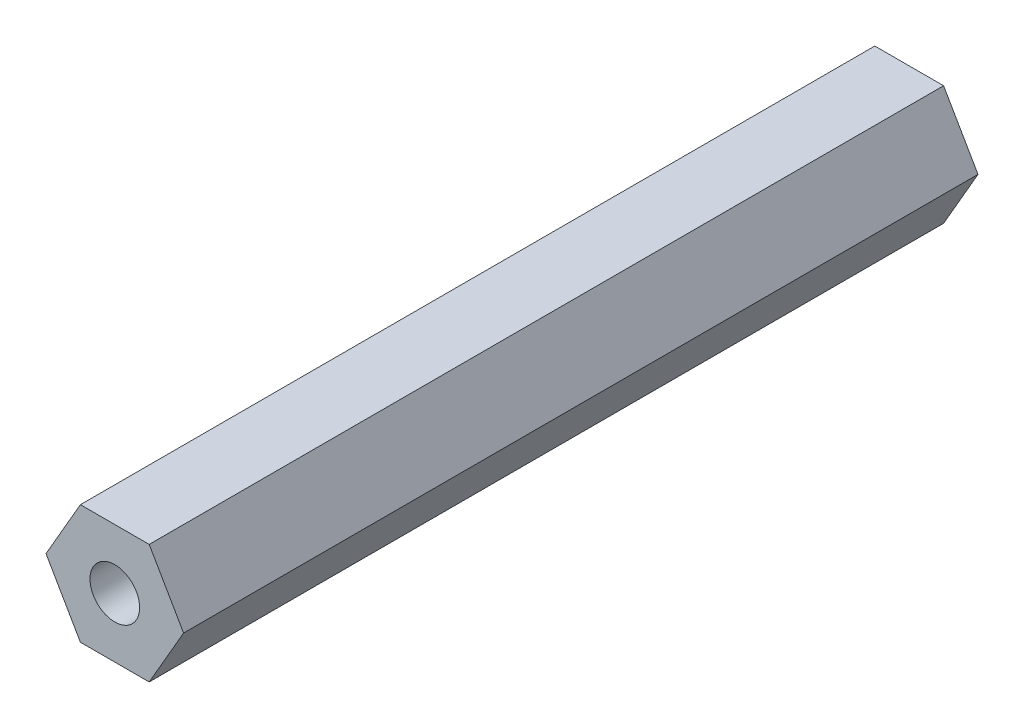
ISO-10303-21;
HEADER;
FILE_DESCRIPTION(('STEP AP214'),'2;1');
FILE_NAME('part.step','',(''),(''),'','','');
FILE_SCHEMA(('AUTOMOTIVE_DESIGN { 1 0 10303 214 1 1 1 1 }'));
ENDSEC;
DATA;
#1=APPLICATION_CONTEXT('core data for automotive mechanical design processes');
#2=APPLICATION_PROTOCOL_DEFINITION('international standard','automotive_design',2000,#1);
#3=PRODUCT_CONTEXT('',#1,'mechanical');
#4=PRODUCT('Part','Part','',(#3));
#5=PRODUCT_RELATED_PRODUCT_CATEGORY('part','',(#4));
#6=PRODUCT_DEFINITION_FORMATION('','',#4);
#7=PRODUCT_DEFINITION_CONTEXT('part definition',#1,'design');
#8=PRODUCT_DEFINITION('design','',#6,#7);
#9=PRODUCT_DEFINITION_SHAPE('','',#8);
#10=(LENGTH_UNIT() NAMED_UNIT(*) SI_UNIT(.MILLI.,.METRE.));
#11=(NAMED_UNIT(*) PLANE_ANGLE_UNIT() SI_UNIT($,.RADIAN.));
#12=(NAMED_UNIT(*) SI_UNIT($,.STERADIAN.) SOLID_ANGLE_UNIT());
#13=UNCERTAINTY_MEASURE_WITH_UNIT(LENGTH_MEASURE(1.E-05),#10,'distance_accuracy_value','');
#14=(GEOMETRIC_REPRESENTATION_CONTEXT(3) GLOBAL_UNCERTAINTY_ASSIGNED_CONTEXT((#13)) GLOBAL_UNIT_ASSIGNED_CONTEXT((#10,
#11,#12)) REPRESENTATION_CONTEXT('',''));
#15=CARTESIAN_POINT('',(0.,0.,0.));
#16=DIRECTION('',(0.,0.,1.));
#17=DIRECTION('',(1.,0.,0.));
#18=AXIS2_PLACEMENT_3D('',#15,#16,#17);
#19=CARTESIAN_POINT('',(1.73205080756887,-3.00000000000002,-40.));
#20=DIRECTION('',(0.866025403784439,-0.5,0.));
#21=DIRECTION('',(0.5,0.866025403784439,0.));
#22=AXIS2_PLACEMENT_3D('',#19,#20,#21);
#23=PLANE('',#22);
#24=DIRECTION('',(0.5,0.866025403784439,0.));
#25=VECTOR('',#24,1.);
#26=CARTESIAN_POINT('',(1.73205080756887,-3.00000000000002,0.));
#27=LINE('',#26,#25);
#28=CARTESIAN_POINT('',(1.73205080756887,-3.00000000000002,0.));
#29=VERTEX_POINT('',#28);
#30=CARTESIAN_POINT('',(3.46410161513776,0.,0.));
#31=VERTEX_POINT('',#30);
#32=EDGE_CURVE('E132',#29,#31,#27,.T.);
#33=ORIENTED_EDGE('',*,*,#32,.F.);
#34=DIRECTION('',(0.,0.,1.));
#35=VECTOR('',#34,1.);
#36=CARTESIAN_POINT('',(1.73205080756887,-3.00000000000002,-40.));
#37=LINE('',#36,#35);
#38=CARTESIAN_POINT('',(1.73205080756887,-3.00000000000002,-40.));
#39=VERTEX_POINT('',#38);
#40=EDGE_CURVE('E11',#39,#29,#37,.T.);
#41=ORIENTED_EDGE('',*,*,#40,.F.);
#42=DIRECTION('',(0.5,0.866025403784439,0.));
#43=VECTOR('',#42,1.);
#44=CARTESIAN_POINT('',(1.73205080756887,-3.00000000000002,-40.));
#45=LINE('',#44,#43);
#46=CARTESIAN_POINT('',(3.46410161513776,0.,-40.));
#47=VERTEX_POINT('',#46);
#48=EDGE_CURVE('E153',#39,#47,#45,.T.);
#49=ORIENTED_EDGE('',*,*,#48,.T.);
#50=DIRECTION('',(0.,0.,1.));
#51=VECTOR('',#50,1.);
#52=CARTESIAN_POINT('',(3.46410161513776,0.,-40.));
#53=LINE('',#52,#51);
#54=EDGE_CURVE('E44',#47,#31,#53,.T.);
#55=ORIENTED_EDGE('',*,*,#54,.T.);
#56=EDGE_LOOP('',(#33,#41,#49,#55));
#57=FACE_BOUND('',#56,.T.);
#58=ADVANCED_FACE('F41',(#57),#23,.T.);
#59=CARTESIAN_POINT('',(-1.73205080756893,-3.00000000000002,-40.));
#60=DIRECTION('',(0.,-1.,0.));
#61=DIRECTION('',(1.,0.,0.));
#62=AXIS2_PLACEMENT_3D('',#59,#60,#61);
#63=PLANE('',#62);
#64=DIRECTION('',(1.,0.,0.));
#65=VECTOR('',#64,1.);
#66=CARTESIAN_POINT('',(-1.73205080756893,-3.00000000000002,0.));
#67=LINE('',#66,#65);
#68=CARTESIAN_POINT('',(-1.73205080756893,-3.00000000000002,0.));
#69=VERTEX_POINT('',#68);
#70=EDGE_CURVE('E150',#69,#29,#67,.T.);
#71=ORIENTED_EDGE('',*,*,#70,.F.);
#72=DIRECTION('',(0.,0.,1.));
#73=VECTOR('',#72,1.);
#74=CARTESIAN_POINT('',(-1.73205080756893,-3.00000000000002,-40.));
#75=LINE('',#74,#73);
#76=CARTESIAN_POINT('',(-1.73205080756893,-3.00000000000002,-40.));
#77=VERTEX_POINT('',#76);
#78=EDGE_CURVE('E51',#77,#69,#75,.T.);
#79=ORIENTED_EDGE('',*,*,#78,.F.);
#80=DIRECTION('',(1.,0.,0.));
#81=VECTOR('',#80,1.);
#82=CARTESIAN_POINT('',(-1.73205080756893,-3.00000000000002,-40.));
#83=LINE('',#82,#81);
#84=EDGE_CURVE('E118',#77,#39,#83,.T.);
#85=ORIENTED_EDGE('',*,*,#84,.T.);
#86=ORIENTED_EDGE('',*,*,#40,.T.);
#87=EDGE_LOOP('',(#71,#79,#85,#86));
#88=FACE_BOUND('',#87,.T.);
#89=ADVANCED_FACE('F165',(#88),#63,.T.);
#90=CARTESIAN_POINT('',(-3.4641016151378,0.,-40.));
#91=DIRECTION('',(-0.866025403784441,-0.499999999999997,0.));
#92=DIRECTION('',(0.499999999999997,-0.866025403784441,0.));
#93=AXIS2_PLACEMENT_3D('',#90,#91,#92);
#94=PLANE('',#93);
#95=DIRECTION('',(0.499999999999997,-0.866025403784441,0.));
#96=VECTOR('',#95,1.);
#97=CARTESIAN_POINT('',(-3.4641016151378,0.,0.));
#98=LINE('',#97,#96);
#99=CARTESIAN_POINT('',(-3.4641016151378,0.,0.));
#100=VERTEX_POINT('',#99);
#101=EDGE_CURVE('E104',#100,#69,#98,.T.);
#102=ORIENTED_EDGE('',*,*,#101,.F.);
#103=DIRECTION('',(0.,0.,1.));
#104=VECTOR('',#103,1.);
#105=CARTESIAN_POINT('',(-3.4641016151378,0.,-40.));
#106=LINE('',#105,#104);
#107=CARTESIAN_POINT('',(-3.4641016151378,0.,-40.));
#108=VERTEX_POINT('',#107);
#109=EDGE_CURVE('E99',#108,#100,#106,.T.);
#110=ORIENTED_EDGE('',*,*,#109,.F.);
#111=DIRECTION('',(0.499999999999997,-0.866025403784441,0.));
#112=VECTOR('',#111,1.);
#113=CARTESIAN_POINT('',(-3.4641016151378,0.,-40.));
#114=LINE('',#113,#112);
#115=EDGE_CURVE('E102',#108,#77,#114,.T.);
#116=ORIENTED_EDGE('',*,*,#115,.T.);
#117=ORIENTED_EDGE('',*,*,#78,.T.);
#118=EDGE_LOOP('',(#102,#110,#116,#117));
#119=FACE_BOUND('',#118,.T.);
#120=ADVANCED_FACE('F101',(#119),#94,.T.);
#121=CARTESIAN_POINT('',(-1.73205080756889,3.00000000000006,-40.));
#122=DIRECTION('',(-0.86602540378444,0.499999999999998,0.));
#123=DIRECTION('',(-0.499999999999998,-0.86602540378444,0.));
#124=AXIS2_PLACEMENT_3D('',#121,#122,#123);
#125=PLANE('',#124);
#126=DIRECTION('',(-0.499999999999998,-0.86602540378444,0.));
#127=VECTOR('',#126,1.);
#128=CARTESIAN_POINT('',(-1.73205080756889,3.00000000000006,0.));
#129=LINE('',#128,#127);
#130=CARTESIAN_POINT('',(-1.73205080756889,3.00000000000006,0.));
#131=VERTEX_POINT('',#130);
#132=EDGE_CURVE('E145',#131,#100,#129,.T.);
#133=ORIENTED_EDGE('',*,*,#132,.F.);
#134=DIRECTION('',(0.,0.,1.));
#135=VECTOR('',#134,1.);
#136=CARTESIAN_POINT('',(-1.73205080756889,3.00000000000006,-40.));
#137=LINE('',#136,#135);
#138=CARTESIAN_POINT('',(-1.73205080756889,3.00000000000006,-40.));
#139=VERTEX_POINT('',#138);
#140=EDGE_CURVE('E110',#139,#131,#137,.T.);
#141=ORIENTED_EDGE('',*,*,#140,.F.);
#142=DIRECTION('',(-0.499999999999998,-0.86602540378444,0.));
#143=VECTOR('',#142,1.);
#144=CARTESIAN_POINT('',(-1.73205080756889,3.00000000000006,-40.));
#145=LINE('',#144,#143);
#146=EDGE_CURVE('E116',#139,#108,#145,.T.);
#147=ORIENTED_EDGE('',*,*,#146,.T.);
#148=ORIENTED_EDGE('',*,*,#109,.T.);
#149=EDGE_LOOP('',(#133,#141,#147,#148));
#150=FACE_BOUND('',#149,.T.);
#151=ADVANCED_FACE('F121',(#150),#125,.T.);
#152=CARTESIAN_POINT('',(1.73205080756885,3.00000000000006,-40.));
#153=DIRECTION('',(0.,1.,0.));
#154=DIRECTION('',(0.,0.,1.));
#155=AXIS2_PLACEMENT_3D('',#152,#153,#154);
#156=PLANE('',#155);
#157=DIRECTION('',(-1.,0.,0.));
#158=VECTOR('',#157,1.);
#159=CARTESIAN_POINT('',(1.73205080756885,3.00000000000006,0.));
#160=LINE('',#159,#158);
#161=CARTESIAN_POINT('',(1.73205080756885,3.00000000000006,0.));
#162=VERTEX_POINT('',#161);
#163=EDGE_CURVE('E141',#162,#131,#160,.T.);
#164=ORIENTED_EDGE('',*,*,#163,.F.);
#165=DIRECTION('',(0.,0.,1.));
#166=VECTOR('',#165,1.);
#167=CARTESIAN_POINT('',(1.73205080756885,3.00000000000006,-40.));
#168=LINE('',#167,#166);
#169=CARTESIAN_POINT('',(1.73205080756885,3.00000000000006,-40.));
#170=VERTEX_POINT('',#169);
#171=EDGE_CURVE('E158',#170,#162,#168,.T.);
#172=ORIENTED_EDGE('',*,*,#171,.F.);
#173=DIRECTION('',(-1.,0.,0.));
#174=VECTOR('',#173,1.);
#175=CARTESIAN_POINT('',(1.73205080756885,3.00000000000006,-40.));
#176=LINE('',#175,#174);
#177=EDGE_CURVE('E123',#170,#139,#176,.T.);
#178=ORIENTED_EDGE('',*,*,#177,.T.);
#179=ORIENTED_EDGE('',*,*,#140,.T.);
#180=EDGE_LOOP('',(#164,#172,#178,#179));
#181=FACE_BOUND('',#180,.T.);
#182=ADVANCED_FACE('F178',(#181),#156,.T.);
#183=CARTESIAN_POINT('',(3.46410161513776,0.,-40.));
#184=DIRECTION('',(0.866025403784439,0.499999999999999,0.));
#185=DIRECTION('',(-0.499999999999999,0.866025403784439,0.));
#186=AXIS2_PLACEMENT_3D('',#183,#184,#185);
#187=PLANE('',#186);
#188=DIRECTION('',(-0.499999999999999,0.866025403784439,0.));
#189=VECTOR('',#188,1.);
#190=CARTESIAN_POINT('',(3.46410161513776,0.,0.));
#191=LINE('',#190,#189);
#192=EDGE_CURVE('E136',#31,#162,#191,.T.);
#193=ORIENTED_EDGE('',*,*,#192,.F.);
#194=ORIENTED_EDGE('',*,*,#54,.F.);
#195=DIRECTION('',(-0.499999999999999,0.866025403784439,0.));
#196=VECTOR('',#195,1.);
#197=CARTESIAN_POINT('',(3.46410161513776,0.,-40.));
#198=LINE('',#197,#196);
#199=EDGE_CURVE('E126',#47,#170,#198,.T.);
#200=ORIENTED_EDGE('',*,*,#199,.T.);
#201=ORIENTED_EDGE('',*,*,#171,.T.);
#202=EDGE_LOOP('',(#193,#194,#200,#201));
#203=FACE_BOUND('',#202,.T.);
#204=ADVANCED_FACE('F162',(#203),#187,.T.);
#205=CARTESIAN_POINT('',(0.,0.,-40.));
#206=DIRECTION('',(0.,0.,1.));
#207=DIRECTION('',(1.,0.,0.));
#208=AXIS2_PLACEMENT_3D('',#205,#206,#207);
#209=PLANE('',#208);
#210=CARTESIAN_POINT('',(0.,0.,-40.));
#211=DIRECTION('',(0.,0.,1.));
#212=DIRECTION('',(1.,0.,0.));
#213=AXIS2_PLACEMENT_3D('',#210,#211,#212);
#214=CIRCLE('',#213,1.25);
#215=CARTESIAN_POINT('',(1.25,0.,-40.));
#216=VERTEX_POINT('',#215);
#217=EDGE_CURVE('E137',#216,#216,#214,.T.);
#218=ORIENTED_EDGE('',*,*,#217,.T.);
#219=EDGE_LOOP('',(#218));
#220=FACE_BOUND('',#219,.T.);
#221=ORIENTED_EDGE('',*,*,#48,.F.);
#222=ORIENTED_EDGE('',*,*,#84,.F.);
#223=ORIENTED_EDGE('',*,*,#115,.F.);
#224=ORIENTED_EDGE('',*,*,#146,.F.);
#225=ORIENTED_EDGE('',*,*,#177,.F.);
#226=ORIENTED_EDGE('',*,*,#199,.F.);
#227=EDGE_LOOP('',(#221,#222,#223,#224,#225,#226));
#228=FACE_BOUND('',#227,.T.);
#229=ADVANCED_FACE('F114',(#220,#228),#209,.F.);
#230=CARTESIAN_POINT('',(0.,0.,0.));
#231=DIRECTION('',(0.,0.,1.));
#232=DIRECTION('',(1.,0.,0.));
#233=AXIS2_PLACEMENT_3D('',#230,#231,#232);
#234=PLANE('',#233);
#235=CARTESIAN_POINT('',(0.,0.,0.));
#236=DIRECTION('',(0.,0.,1.));
#237=DIRECTION('',(1.,0.,0.));
#238=AXIS2_PLACEMENT_3D('',#235,#236,#237);
#239=CIRCLE('',#238,1.25);
#240=CARTESIAN_POINT('',(1.25,0.,0.));
#241=VERTEX_POINT('',#240);
#242=EDGE_CURVE('E201',#241,#241,#239,.T.);
#243=ORIENTED_EDGE('',*,*,#242,.F.);
#244=EDGE_LOOP('',(#243));
#245=FACE_BOUND('',#244,.T.);
#246=ORIENTED_EDGE('',*,*,#32,.T.);
#247=ORIENTED_EDGE('',*,*,#192,.T.);
#248=ORIENTED_EDGE('',*,*,#163,.T.);
#249=ORIENTED_EDGE('',*,*,#132,.T.);
#250=ORIENTED_EDGE('',*,*,#101,.T.);
#251=ORIENTED_EDGE('',*,*,#70,.T.);
#252=EDGE_LOOP('',(#246,#247,#248,#249,#250,#251));
#253=FACE_BOUND('',#252,.T.);
#254=ADVANCED_FACE('F164',(#245,#253),#234,.T.);
#255=CARTESIAN_POINT('',(0.,0.,-40.));
#256=DIRECTION('',(0.,0.,1.));
#257=DIRECTION('',(1.,0.,0.));
#258=AXIS2_PLACEMENT_3D('',#255,#256,#257);
#259=CYLINDRICAL_SURFACE('',#258,1.25);
#260=ORIENTED_EDGE('',*,*,#217,.F.);
#261=EDGE_LOOP('',(#260));
#262=FACE_BOUND('',#261,.T.);
#263=ORIENTED_EDGE('',*,*,#242,.T.);
#264=EDGE_LOOP('',(#263));
#265=FACE_BOUND('',#264,.T.);
#266=ADVANCED_FACE('F189',(#262,#265),#259,.F.);
#267=CLOSED_SHELL('',(#58,#89,#120,#151,#182,#204,#229,#254,#266));
#268=MANIFOLD_SOLID_BREP('B2',#267);
#269=ADVANCED_BREP_SHAPE_REPRESENTATION('',(#18,#268),#14);
#270=SHAPE_DEFINITION_REPRESENTATION(#9,#269);
ENDSEC;
END-ISO-10303-21;
